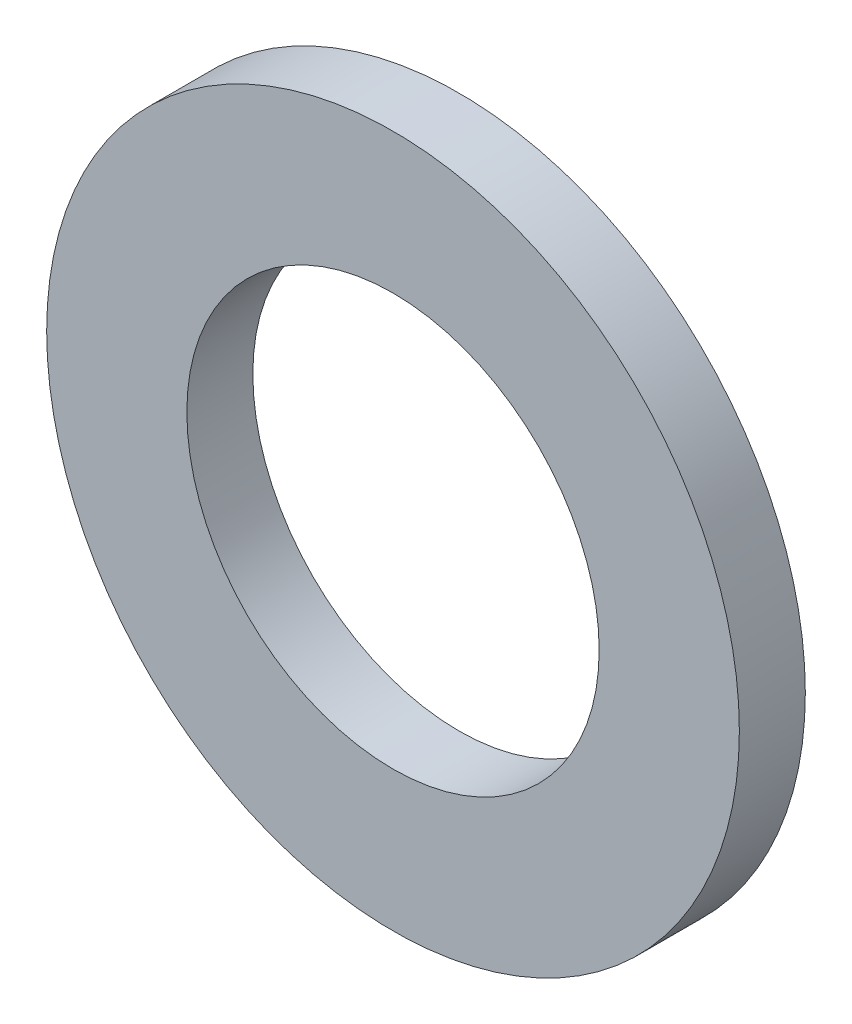
ISO-10303-21;
HEADER;
FILE_DESCRIPTION(('STEP AP214'),'2;1');
FILE_NAME('part.step','',(''),(''),'','','');
FILE_SCHEMA(('AUTOMOTIVE_DESIGN { 1 0 10303 214 1 1 1 1 }'));
ENDSEC;
DATA;
#1=APPLICATION_CONTEXT('core data for automotive mechanical design processes');
#2=APPLICATION_PROTOCOL_DEFINITION('international standard','automotive_design',2000,#1);
#3=PRODUCT_CONTEXT('',#1,'mechanical');
#4=PRODUCT('Part','Part','',(#3));
#5=PRODUCT_RELATED_PRODUCT_CATEGORY('part','',(#4));
#6=PRODUCT_DEFINITION_FORMATION('','',#4);
#7=PRODUCT_DEFINITION_CONTEXT('part definition',#1,'design');
#8=PRODUCT_DEFINITION('design','',#6,#7);
#9=PRODUCT_DEFINITION_SHAPE('','',#8);
#10=(LENGTH_UNIT() NAMED_UNIT(*) SI_UNIT(.MILLI.,.METRE.));
#11=(NAMED_UNIT(*) PLANE_ANGLE_UNIT() SI_UNIT($,.RADIAN.));
#12=(NAMED_UNIT(*) SI_UNIT($,.STERADIAN.) SOLID_ANGLE_UNIT());
#13=UNCERTAINTY_MEASURE_WITH_UNIT(LENGTH_MEASURE(1.E-05),#10,'distance_accuracy_value','');
#14=(GEOMETRIC_REPRESENTATION_CONTEXT(3) GLOBAL_UNCERTAINTY_ASSIGNED_CONTEXT((#13)) GLOBAL_UNIT_ASSIGNED_CONTEXT((#10,
#11,#12)) REPRESENTATION_CONTEXT('',''));
#15=CARTESIAN_POINT('',(0.,0.,0.));
#16=DIRECTION('',(0.,0.,1.));
#17=DIRECTION('',(1.,0.,0.));
#18=AXIS2_PLACEMENT_3D('',#15,#16,#17);
#19=CARTESIAN_POINT('',(0.,0.,4.));
#20=DIRECTION('',(0.,0.,1.));
#21=DIRECTION('',(1.,0.,0.));
#22=AXIS2_PLACEMENT_3D('',#19,#20,#21);
#23=PLANE('',#22);
#24=CARTESIAN_POINT('',(0.,0.,4.));
#25=DIRECTION('',(0.,0.,1.));
#26=DIRECTION('',(1.,0.,0.));
#27=AXIS2_PLACEMENT_3D('',#24,#25,#26);
#28=CIRCLE('',#27,21.);
#29=CARTESIAN_POINT('',(21.,0.,4.));
#30=VERTEX_POINT('',#29);
#31=EDGE_CURVE('E10',#30,#30,#28,.T.);
#32=ORIENTED_EDGE('',*,*,#31,.T.);
#33=EDGE_LOOP('',(#32));
#34=FACE_BOUND('',#33,.T.);
#35=CARTESIAN_POINT('',(0.,0.,4.));
#36=DIRECTION('',(0.,0.,1.));
#37=DIRECTION('',(1.,0.,0.));
#38=AXIS2_PLACEMENT_3D('',#35,#36,#37);
#39=CIRCLE('',#38,12.5);
#40=CARTESIAN_POINT('',(12.5,0.,4.));
#41=VERTEX_POINT('',#40);
#42=EDGE_CURVE('E46',#41,#41,#39,.T.);
#43=ORIENTED_EDGE('',*,*,#42,.F.);
#44=EDGE_LOOP('',(#43));
#45=FACE_BOUND('',#44,.T.);
#46=ADVANCED_FACE('F35',(#34,#45),#23,.T.);
#47=CARTESIAN_POINT('',(0.,0.,0.));
#48=DIRECTION('',(0.,0.,1.));
#49=DIRECTION('',(1.,0.,0.));
#50=AXIS2_PLACEMENT_3D('',#47,#48,#49);
#51=PLANE('',#50);
#52=CARTESIAN_POINT('',(0.,0.,0.));
#53=DIRECTION('',(0.,0.,1.));
#54=DIRECTION('',(1.,0.,0.));
#55=AXIS2_PLACEMENT_3D('',#52,#53,#54);
#56=CIRCLE('',#55,21.);
#57=CARTESIAN_POINT('',(21.,0.,0.));
#58=VERTEX_POINT('',#57);
#59=EDGE_CURVE('E39',#58,#58,#56,.T.);
#60=ORIENTED_EDGE('',*,*,#59,.F.);
#61=EDGE_LOOP('',(#60));
#62=FACE_BOUND('',#61,.T.);
#63=CARTESIAN_POINT('',(0.,0.,0.));
#64=DIRECTION('',(0.,0.,1.));
#65=DIRECTION('',(1.,0.,0.));
#66=AXIS2_PLACEMENT_3D('',#63,#64,#65);
#67=CIRCLE('',#66,12.5);
#68=CARTESIAN_POINT('',(12.5,0.,0.));
#69=VERTEX_POINT('',#68);
#70=EDGE_CURVE('E48',#69,#69,#67,.T.);
#71=ORIENTED_EDGE('',*,*,#70,.T.);
#72=EDGE_LOOP('',(#71));
#73=FACE_BOUND('',#72,.T.);
#74=ADVANCED_FACE('F58',(#62,#73),#51,.F.);
#75=CARTESIAN_POINT('',(0.,0.,4.));
#76=DIRECTION('',(0.,0.,-1.));
#77=DIRECTION('',(-1.,0.,0.));
#78=AXIS2_PLACEMENT_3D('',#75,#76,#77);
#79=CYLINDRICAL_SURFACE('',#78,21.);
#80=ORIENTED_EDGE('',*,*,#31,.F.);
#81=EDGE_LOOP('',(#80));
#82=FACE_BOUND('',#81,.T.);
#83=ORIENTED_EDGE('',*,*,#59,.T.);
#84=EDGE_LOOP('',(#83));
#85=FACE_BOUND('',#84,.T.);
#86=ADVANCED_FACE('F37',(#82,#85),#79,.T.);
#87=CARTESIAN_POINT('',(0.,0.,4.));
#88=DIRECTION('',(0.,0.,-1.));
#89=DIRECTION('',(-1.,0.,0.));
#90=AXIS2_PLACEMENT_3D('',#87,#88,#89);
#91=CYLINDRICAL_SURFACE('',#90,12.5);
#92=ORIENTED_EDGE('',*,*,#42,.T.);
#93=EDGE_LOOP('',(#92));
#94=FACE_BOUND('',#93,.T.);
#95=ORIENTED_EDGE('',*,*,#70,.F.);
#96=EDGE_LOOP('',(#95));
#97=FACE_BOUND('',#96,.T.);
#98=ADVANCED_FACE('F54',(#94,#97),#91,.F.);
#99=CLOSED_SHELL('',(#46,#74,#86,#98));
#100=MANIFOLD_SOLID_BREP('B2',#99);
#101=ADVANCED_BREP_SHAPE_REPRESENTATION('',(#18,#100),#14);
#102=SHAPE_DEFINITION_REPRESENTATION(#9,#101);
ENDSEC;
END-ISO-10303-21;
